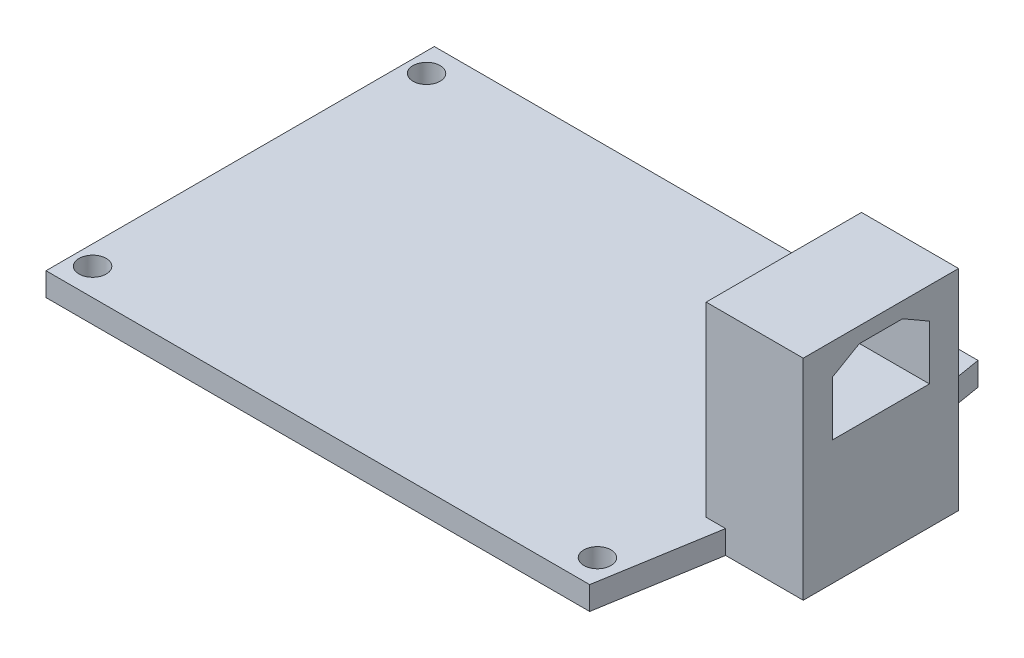
ISO-10303-21;
HEADER;
FILE_DESCRIPTION(('STEP AP214'),'2;1');
FILE_NAME('part.step','',(''),(''),'','','');
FILE_SCHEMA(('AUTOMOTIVE_DESIGN { 1 0 10303 214 1 1 1 1 }'));
ENDSEC;
DATA;
#1=APPLICATION_CONTEXT('core data for automotive mechanical design processes');
#2=APPLICATION_PROTOCOL_DEFINITION('international standard','automotive_design',2000,#1);
#3=PRODUCT_CONTEXT('',#1,'mechanical');
#4=PRODUCT('Part','Part','',(#3));
#5=PRODUCT_RELATED_PRODUCT_CATEGORY('part','',(#4));
#6=PRODUCT_DEFINITION_FORMATION('','',#4);
#7=PRODUCT_DEFINITION_CONTEXT('part definition',#1,'design');
#8=PRODUCT_DEFINITION('design','',#6,#7);
#9=PRODUCT_DEFINITION_SHAPE('','',#8);
#10=(LENGTH_UNIT() NAMED_UNIT(*) SI_UNIT(.MILLI.,.METRE.));
#11=(NAMED_UNIT(*) PLANE_ANGLE_UNIT() SI_UNIT($,.RADIAN.));
#12=(NAMED_UNIT(*) SI_UNIT($,.STERADIAN.) SOLID_ANGLE_UNIT());
#13=UNCERTAINTY_MEASURE_WITH_UNIT(LENGTH_MEASURE(1.E-05),#10,'distance_accuracy_value','');
#14=(GEOMETRIC_REPRESENTATION_CONTEXT(3) GLOBAL_UNCERTAINTY_ASSIGNED_CONTEXT((#13)) GLOBAL_UNIT_ASSIGNED_CONTEXT((#10,
#11,#12)) REPRESENTATION_CONTEXT('',''));
#15=CARTESIAN_POINT('',(0.,0.,0.));
#16=DIRECTION('',(0.,0.,1.));
#17=DIRECTION('',(1.,0.,0.));
#18=AXIS2_PLACEMENT_3D('',#15,#16,#17);
#19=CARTESIAN_POINT('',(35.,28.,0.));
#20=DIRECTION('',(-1.,0.,0.));
#21=DIRECTION('',(0.,0.,1.));
#22=AXIS2_PLACEMENT_3D('',#19,#20,#21);
#23=PLANE('',#22);
#24=DIRECTION('',(0.,0.,1.));
#25=VECTOR('',#24,1.);
#26=CARTESIAN_POINT('',(35.,27.,0.));
#27=LINE('',#26,#25);
#28=CARTESIAN_POINT('',(35.,27.,-10.));
#29=VERTEX_POINT('',#28);
#30=CARTESIAN_POINT('',(35.,27.,10.));
#31=VERTEX_POINT('',#30);
#32=EDGE_CURVE('E176',#29,#31,#27,.T.);
#33=ORIENTED_EDGE('',*,*,#32,.F.);
#34=DIRECTION('',(0.,-1.,0.));
#35=VECTOR('',#34,1.);
#36=CARTESIAN_POINT('',(35.,28.,-10.));
#37=LINE('',#36,#35);
#38=CARTESIAN_POINT('',(35.,3.,-10.));
#39=VERTEX_POINT('',#38);
#40=EDGE_CURVE('E189',#29,#39,#37,.T.);
#41=ORIENTED_EDGE('',*,*,#40,.T.);
#42=DIRECTION('',(0.,0.,-1.));
#43=VECTOR('',#42,1.);
#44=CARTESIAN_POINT('',(35.,3.,25.));
#45=LINE('',#44,#43);
#46=CARTESIAN_POINT('',(35.,3.,10.));
#47=VERTEX_POINT('',#46);
#48=EDGE_CURVE('E187',#47,#39,#45,.T.);
#49=ORIENTED_EDGE('',*,*,#48,.F.);
#50=DIRECTION('',(0.,-1.,0.));
#51=VECTOR('',#50,1.);
#52=CARTESIAN_POINT('',(35.,28.,10.));
#53=LINE('',#52,#51);
#54=EDGE_CURVE('E164',#31,#47,#53,.T.);
#55=ORIENTED_EDGE('',*,*,#54,.F.);
#56=EDGE_LOOP('',(#33,#41,#49,#55));
#57=FACE_BOUND('',#56,.T.);
#58=DIRECTION('',(0.,0.499999999999998,0.86602540378444));
#59=VECTOR('',#58,1.);
#60=CARTESIAN_POINT('',(35.,26.9563293868264,0.602563509461099));
#61=LINE('',#60,#59);
#62=CARTESIAN_POINT('',(35.,23.,-6.25000000000001));
#63=VERTEX_POINT('',#62);
#64=CARTESIAN_POINT('',(35.,25.,-2.78589838486224));
#65=VERTEX_POINT('',#64);
#66=EDGE_CURVE('E322',#63,#65,#61,.T.);
#67=ORIENTED_EDGE('',*,*,#66,.T.);
#68=DIRECTION('',(0.,0.,1.));
#69=VECTOR('',#68,1.);
#70=CARTESIAN_POINT('',(35.,25.,0.));
#71=LINE('',#70,#69);
#72=CARTESIAN_POINT('',(35.,25.,2.78589838486223));
#73=VERTEX_POINT('',#72);
#74=EDGE_CURVE('E316',#65,#73,#71,.T.);
#75=ORIENTED_EDGE('',*,*,#74,.T.);
#76=DIRECTION('',(0.,-0.5,0.866025403784439));
#77=VECTOR('',#76,1.);
#78=CARTESIAN_POINT('',(35.,26.9563293868264,-0.602563509461099));
#79=LINE('',#78,#77);
#80=CARTESIAN_POINT('',(35.,23.,6.24999999999999));
#81=VERTEX_POINT('',#80);
#82=EDGE_CURVE('E336',#73,#81,#79,.T.);
#83=ORIENTED_EDGE('',*,*,#82,.T.);
#84=DIRECTION('',(0.,1.,0.));
#85=VECTOR('',#84,1.);
#86=CARTESIAN_POINT('',(35.,28.,6.24999999999999));
#87=LINE('',#86,#85);
#88=CARTESIAN_POINT('',(35.,16.,6.24999999999999));
#89=VERTEX_POINT('',#88);
#90=EDGE_CURVE('E333',#89,#81,#87,.T.);
#91=ORIENTED_EDGE('',*,*,#90,.F.);
#92=DIRECTION('',(0.,0.,1.));
#93=VECTOR('',#92,1.);
#94=CARTESIAN_POINT('',(35.,16.,0.));
#95=LINE('',#94,#93);
#96=CARTESIAN_POINT('',(35.,16.,-6.25000000000001));
#97=VERTEX_POINT('',#96);
#98=EDGE_CURVE('E330',#97,#89,#95,.T.);
#99=ORIENTED_EDGE('',*,*,#98,.F.);
#100=DIRECTION('',(0.,1.,0.));
#101=VECTOR('',#100,1.);
#102=CARTESIAN_POINT('',(35.,28.,-6.25000000000001));
#103=LINE('',#102,#101);
#104=EDGE_CURVE('E326',#97,#63,#103,.T.);
#105=ORIENTED_EDGE('',*,*,#104,.T.);
#106=EDGE_LOOP('',(#67,#75,#83,#91,#99,#105));
#107=FACE_BOUND('',#106,.T.);
#108=ADVANCED_FACE('F45',(#57,#107),#23,.T.);
#109=CARTESIAN_POINT('',(-35.,3.,25.));
#110=DIRECTION('',(1.,0.,0.));
#111=DIRECTION('',(0.,0.,-1.));
#112=AXIS2_PLACEMENT_3D('',#109,#110,#111);
#113=PLANE('',#112);
#114=DIRECTION('',(0.,0.,1.));
#115=VECTOR('',#114,1.);
#116=CARTESIAN_POINT('',(-35.,0.,25.));
#117=LINE('',#116,#115);
#118=CARTESIAN_POINT('',(-35.,0.,-25.));
#119=VERTEX_POINT('',#118);
#120=CARTESIAN_POINT('',(-35.,0.,25.));
#121=VERTEX_POINT('',#120);
#122=EDGE_CURVE('E232',#119,#121,#117,.T.);
#123=ORIENTED_EDGE('',*,*,#122,.T.);
#124=DIRECTION('',(0.,-1.,0.));
#125=VECTOR('',#124,1.);
#126=CARTESIAN_POINT('',(-35.,3.,25.));
#127=LINE('',#126,#125);
#128=CARTESIAN_POINT('',(-35.,3.,25.));
#129=VERTEX_POINT('',#128);
#130=EDGE_CURVE('E11',#129,#121,#127,.T.);
#131=ORIENTED_EDGE('',*,*,#130,.F.);
#132=DIRECTION('',(0.,0.,1.));
#133=VECTOR('',#132,1.);
#134=CARTESIAN_POINT('',(-35.,3.,25.));
#135=LINE('',#134,#133);
#136=CARTESIAN_POINT('',(-35.,3.,-25.));
#137=VERTEX_POINT('',#136);
#138=EDGE_CURVE('E218',#137,#129,#135,.T.);
#139=ORIENTED_EDGE('',*,*,#138,.F.);
#140=DIRECTION('',(0.,-1.,0.));
#141=VECTOR('',#140,1.);
#142=CARTESIAN_POINT('',(-35.,3.,-25.));
#143=LINE('',#142,#141);
#144=EDGE_CURVE('E231',#137,#119,#143,.T.);
#145=ORIENTED_EDGE('',*,*,#144,.T.);
#146=EDGE_LOOP('',(#123,#131,#139,#145));
#147=FACE_BOUND('',#146,.T.);
#148=ADVANCED_FACE('F47',(#147),#113,.F.);
#149=CARTESIAN_POINT('',(-35.,3.,25.));
#150=DIRECTION('',(0.,0.,-1.));
#151=DIRECTION('',(-1.,0.,0.));
#152=AXIS2_PLACEMENT_3D('',#149,#150,#151);
#153=PLANE('',#152);
#154=DIRECTION('',(1.,0.,0.));
#155=VECTOR('',#154,1.);
#156=CARTESIAN_POINT('',(-35.,0.,25.));
#157=LINE('',#156,#155);
#158=CARTESIAN_POINT('',(35.,0.,25.));
#159=VERTEX_POINT('',#158);
#160=EDGE_CURVE('E236',#121,#159,#157,.T.);
#161=ORIENTED_EDGE('',*,*,#160,.T.);
#162=DIRECTION('',(0.,-1.,0.));
#163=VECTOR('',#162,1.);
#164=CARTESIAN_POINT('',(35.,3.,25.));
#165=LINE('',#164,#163);
#166=CARTESIAN_POINT('',(35.,3.,25.));
#167=VERTEX_POINT('',#166);
#168=EDGE_CURVE('E55',#167,#159,#165,.T.);
#169=ORIENTED_EDGE('',*,*,#168,.F.);
#170=DIRECTION('',(1.,0.,0.));
#171=VECTOR('',#170,1.);
#172=CARTESIAN_POINT('',(-35.,3.,25.));
#173=LINE('',#172,#171);
#174=EDGE_CURVE('E222',#129,#167,#173,.T.);
#175=ORIENTED_EDGE('',*,*,#174,.F.);
#176=ORIENTED_EDGE('',*,*,#130,.T.);
#177=EDGE_LOOP('',(#161,#169,#175,#176));
#178=FACE_BOUND('',#177,.T.);
#179=ADVANCED_FACE('F291',(#178),#153,.F.);
#180=CARTESIAN_POINT('',(-35.,3.,-25.));
#181=DIRECTION('',(0.,0.,1.));
#182=DIRECTION('',(1.,0.,0.));
#183=AXIS2_PLACEMENT_3D('',#180,#181,#182);
#184=PLANE('',#183);
#185=DIRECTION('',(-1.,0.,0.));
#186=VECTOR('',#185,1.);
#187=CARTESIAN_POINT('',(-35.,0.,-25.));
#188=LINE('',#187,#186);
#189=CARTESIAN_POINT('',(35.,0.,-25.));
#190=VERTEX_POINT('',#189);
#191=EDGE_CURVE('E223',#190,#119,#188,.T.);
#192=ORIENTED_EDGE('',*,*,#191,.T.);
#193=ORIENTED_EDGE('',*,*,#144,.F.);
#194=DIRECTION('',(-1.,0.,0.));
#195=VECTOR('',#194,1.);
#196=CARTESIAN_POINT('',(-35.,3.,-25.));
#197=LINE('',#196,#195);
#198=CARTESIAN_POINT('',(35.,3.,-25.));
#199=VERTEX_POINT('',#198);
#200=EDGE_CURVE('E228',#199,#137,#197,.T.);
#201=ORIENTED_EDGE('',*,*,#200,.F.);
#202=DIRECTION('',(0.,-1.,0.));
#203=VECTOR('',#202,1.);
#204=CARTESIAN_POINT('',(35.,3.,-25.));
#205=LINE('',#204,#203);
#206=EDGE_CURVE('E244',#199,#190,#205,.T.);
#207=ORIENTED_EDGE('',*,*,#206,.T.);
#208=EDGE_LOOP('',(#192,#193,#201,#207));
#209=FACE_BOUND('',#208,.T.);
#210=ADVANCED_FACE('F274',(#209),#184,.F.);
#211=CARTESIAN_POINT('',(0.,3.,0.));
#212=DIRECTION('',(0.,-1.,0.));
#213=DIRECTION('',(0.,0.,-1.));
#214=AXIS2_PLACEMENT_3D('',#211,#212,#213);
#215=PLANE('',#214);
#216=CARTESIAN_POINT('',(-32.5,3.,-21.5));
#217=DIRECTION('',(0.,1.,0.));
#218=DIRECTION('',(0.,0.,-1.));
#219=AXIS2_PLACEMENT_3D('',#216,#217,#218);
#220=CIRCLE('',#219,1.75);
#221=CARTESIAN_POINT('',(-32.5,3.,-23.25));
#222=VERTEX_POINT('',#221);
#223=EDGE_CURVE('E194',#222,#222,#220,.T.);
#224=ORIENTED_EDGE('',*,*,#223,.F.);
#225=EDGE_LOOP('',(#224));
#226=FACE_BOUND('',#225,.T.);
#227=CARTESIAN_POINT('',(32.5,3.,-21.5));
#228=DIRECTION('',(0.,-1.,0.));
#229=DIRECTION('',(0.,0.,-1.));
#230=AXIS2_PLACEMENT_3D('',#227,#228,#229);
#231=CIRCLE('',#230,1.75);
#232=CARTESIAN_POINT('',(32.5,3.,-23.25));
#233=VERTEX_POINT('',#232);
#234=EDGE_CURVE('E203',#233,#233,#231,.T.);
#235=ORIENTED_EDGE('',*,*,#234,.T.);
#236=EDGE_LOOP('',(#235));
#237=FACE_BOUND('',#236,.T.);
#238=CARTESIAN_POINT('',(-32.5,3.,21.5));
#239=DIRECTION('',(0.,-1.,0.));
#240=DIRECTION('',(0.,0.,1.));
#241=AXIS2_PLACEMENT_3D('',#238,#239,#240);
#242=CIRCLE('',#241,1.75);
#243=CARTESIAN_POINT('',(-32.5,3.,23.25));
#244=VERTEX_POINT('',#243);
#245=EDGE_CURVE('E208',#244,#244,#242,.T.);
#246=ORIENTED_EDGE('',*,*,#245,.T.);
#247=EDGE_LOOP('',(#246));
#248=FACE_BOUND('',#247,.T.);
#249=CARTESIAN_POINT('',(32.5,3.,21.5));
#250=DIRECTION('',(0.,1.,0.));
#251=DIRECTION('',(0.,0.,1.));
#252=AXIS2_PLACEMENT_3D('',#249,#250,#251);
#253=CIRCLE('',#252,1.75);
#254=CARTESIAN_POINT('',(32.5,3.,23.25));
#255=VERTEX_POINT('',#254);
#256=EDGE_CURVE('E213',#255,#255,#253,.T.);
#257=ORIENTED_EDGE('',*,*,#256,.F.);
#258=EDGE_LOOP('',(#257));
#259=FACE_BOUND('',#258,.T.);
#260=ORIENTED_EDGE('',*,*,#138,.T.);
#261=ORIENTED_EDGE('',*,*,#174,.T.);
#262=DIRECTION('',(0.164398987305358,0.,-0.986393923832144));
#263=VECTOR('',#262,1.);
#264=CARTESIAN_POINT('',(37.5,3.,10.));
#265=LINE('',#264,#263);
#266=CARTESIAN_POINT('',(37.5,3.,10.));
#267=VERTEX_POINT('',#266);
#268=EDGE_CURVE('E295',#167,#267,#265,.T.);
#269=ORIENTED_EDGE('',*,*,#268,.T.);
#270=DIRECTION('',(-1.,0.,0.));
#271=VECTOR('',#270,1.);
#272=CARTESIAN_POINT('',(37.5,3.,10.));
#273=LINE('',#272,#271);
#274=EDGE_CURVE('E71',#267,#47,#273,.T.);
#275=ORIENTED_EDGE('',*,*,#274,.T.);
#276=ORIENTED_EDGE('',*,*,#48,.T.);
#277=DIRECTION('',(-1.,0.,0.));
#278=VECTOR('',#277,1.);
#279=CARTESIAN_POINT('',(37.5,3.,-10.));
#280=LINE('',#279,#278);
#281=CARTESIAN_POINT('',(37.5,3.,-10.));
#282=VERTEX_POINT('',#281);
#283=EDGE_CURVE('E312',#282,#39,#280,.T.);
#284=ORIENTED_EDGE('',*,*,#283,.F.);
#285=DIRECTION('',(0.164398987305358,0.,0.986393923832144));
#286=VECTOR('',#285,1.);
#287=CARTESIAN_POINT('',(37.5,3.,-10.));
#288=LINE('',#287,#286);
#289=EDGE_CURVE('E308',#199,#282,#288,.T.);
#290=ORIENTED_EDGE('',*,*,#289,.F.);
#291=ORIENTED_EDGE('',*,*,#200,.T.);
#292=EDGE_LOOP('',(#260,#261,#269,#275,#276,#284,#290,#291));
#293=FACE_BOUND('',#292,.T.);
#294=ADVANCED_FACE('F271',(#226,#237,#248,#259,#293),#215,.F.);
#295=CARTESIAN_POINT('',(0.,0.,0.));
#296=DIRECTION('',(0.,-1.,0.));
#297=DIRECTION('',(0.,0.,-1.));
#298=AXIS2_PLACEMENT_3D('',#295,#296,#297);
#299=PLANE('',#298);
#300=ORIENTED_EDGE('',*,*,#191,.F.);
#301=DIRECTION('',(0.164398987305358,0.,0.986393923832144));
#302=VECTOR('',#301,1.);
#303=CARTESIAN_POINT('',(37.5,0.,-10.));
#304=LINE('',#303,#302);
#305=CARTESIAN_POINT('',(37.5,0.,-10.));
#306=VERTEX_POINT('',#305);
#307=EDGE_CURVE('E307',#190,#306,#304,.T.);
#308=ORIENTED_EDGE('',*,*,#307,.T.);
#309=DIRECTION('',(-1.,0.,0.));
#310=VECTOR('',#309,1.);
#311=CARTESIAN_POINT('',(47.5,0.,-10.));
#312=LINE('',#311,#310);
#313=CARTESIAN_POINT('',(47.5,0.,-10.));
#314=VERTEX_POINT('',#313);
#315=EDGE_CURVE('E382',#314,#306,#312,.T.);
#316=ORIENTED_EDGE('',*,*,#315,.F.);
#317=DIRECTION('',(0.,0.,-1.));
#318=VECTOR('',#317,1.);
#319=CARTESIAN_POINT('',(47.5,0.,0.));
#320=LINE('',#319,#318);
#321=CARTESIAN_POINT('',(47.5,0.,10.));
#322=VERTEX_POINT('',#321);
#323=EDGE_CURVE('E391',#322,#314,#320,.T.);
#324=ORIENTED_EDGE('',*,*,#323,.F.);
#325=DIRECTION('',(-1.,0.,0.));
#326=VECTOR('',#325,1.);
#327=CARTESIAN_POINT('',(47.5,0.,10.));
#328=LINE('',#327,#326);
#329=CARTESIAN_POINT('',(37.5,0.,10.));
#330=VERTEX_POINT('',#329);
#331=EDGE_CURVE('E173',#322,#330,#328,.T.);
#332=ORIENTED_EDGE('',*,*,#331,.T.);
#333=DIRECTION('',(0.164398987305358,0.,-0.986393923832144));
#334=VECTOR('',#333,1.);
#335=CARTESIAN_POINT('',(37.5,0.,10.));
#336=LINE('',#335,#334);
#337=EDGE_CURVE('E196',#159,#330,#336,.T.);
#338=ORIENTED_EDGE('',*,*,#337,.F.);
#339=ORIENTED_EDGE('',*,*,#160,.F.);
#340=ORIENTED_EDGE('',*,*,#122,.F.);
#341=EDGE_LOOP('',(#300,#308,#316,#324,#332,#338,#339,#340));
#342=FACE_BOUND('',#341,.T.);
#343=CARTESIAN_POINT('',(-32.5,0.,-21.5));
#344=DIRECTION('',(0.,-1.,0.));
#345=DIRECTION('',(0.,0.,-1.));
#346=AXIS2_PLACEMENT_3D('',#343,#344,#345);
#347=CIRCLE('',#346,1.75);
#348=CARTESIAN_POINT('',(-32.5,0.,-23.25));
#349=VERTEX_POINT('',#348);
#350=EDGE_CURVE('E49',#349,#349,#347,.T.);
#351=ORIENTED_EDGE('',*,*,#350,.F.);
#352=EDGE_LOOP('',(#351));
#353=FACE_BOUND('',#352,.T.);
#354=CARTESIAN_POINT('',(32.5,0.,-21.5));
#355=DIRECTION('',(0.,-1.,0.));
#356=DIRECTION('',(0.,0.,-1.));
#357=AXIS2_PLACEMENT_3D('',#354,#355,#356);
#358=CIRCLE('',#357,1.75);
#359=CARTESIAN_POINT('',(32.5,0.,-23.25));
#360=VERTEX_POINT('',#359);
#361=EDGE_CURVE('E207',#360,#360,#358,.F.);
#362=ORIENTED_EDGE('',*,*,#361,.T.);
#363=EDGE_LOOP('',(#362));
#364=FACE_BOUND('',#363,.T.);
#365=CARTESIAN_POINT('',(-32.5,0.,21.5));
#366=DIRECTION('',(0.,-1.,0.));
#367=DIRECTION('',(0.,0.,-1.));
#368=AXIS2_PLACEMENT_3D('',#365,#366,#367);
#369=CIRCLE('',#368,1.75);
#370=CARTESIAN_POINT('',(-32.5,0.,19.75));
#371=VERTEX_POINT('',#370);
#372=EDGE_CURVE('E212',#371,#371,#369,.F.);
#373=ORIENTED_EDGE('',*,*,#372,.T.);
#374=EDGE_LOOP('',(#373));
#375=FACE_BOUND('',#374,.T.);
#376=CARTESIAN_POINT('',(32.5,0.,21.5));
#377=DIRECTION('',(0.,-1.,0.));
#378=DIRECTION('',(0.,0.,-1.));
#379=AXIS2_PLACEMENT_3D('',#376,#377,#378);
#380=CIRCLE('',#379,1.75);
#381=CARTESIAN_POINT('',(32.5,0.,19.75));
#382=VERTEX_POINT('',#381);
#383=EDGE_CURVE('E217',#382,#382,#380,.T.);
#384=ORIENTED_EDGE('',*,*,#383,.F.);
#385=EDGE_LOOP('',(#384));
#386=FACE_BOUND('',#385,.T.);
#387=ADVANCED_FACE('F260',(#342,#353,#364,#375,#386),#299,.T.);
#388=CARTESIAN_POINT('',(32.5,-7.,21.5));
#389=DIRECTION('',(0.,1.,0.));
#390=DIRECTION('',(0.,0.,1.));
#391=AXIS2_PLACEMENT_3D('',#388,#389,#390);
#392=CYLINDRICAL_SURFACE('',#391,1.75);
#393=ORIENTED_EDGE('',*,*,#383,.T.);
#394=EDGE_LOOP('',(#393));
#395=FACE_BOUND('',#394,.T.);
#396=ORIENTED_EDGE('',*,*,#256,.T.);
#397=EDGE_LOOP('',(#396));
#398=FACE_BOUND('',#397,.T.);
#399=ADVANCED_FACE('F412',(#395,#398),#392,.F.);
#400=CARTESIAN_POINT('',(-32.5,-7.,21.5));
#401=DIRECTION('',(0.,1.,0.));
#402=DIRECTION('',(0.,0.,1.));
#403=AXIS2_PLACEMENT_3D('',#400,#401,#402);
#404=CYLINDRICAL_SURFACE('',#403,1.75);
#405=ORIENTED_EDGE('',*,*,#372,.F.);
#406=EDGE_LOOP('',(#405));
#407=FACE_BOUND('',#406,.T.);
#408=ORIENTED_EDGE('',*,*,#245,.F.);
#409=EDGE_LOOP('',(#408));
#410=FACE_BOUND('',#409,.T.);
#411=ADVANCED_FACE('F267',(#407,#410),#404,.F.);
#412=CARTESIAN_POINT('',(32.5,-7.,-21.5));
#413=DIRECTION('',(0.,1.,0.));
#414=DIRECTION('',(0.,0.,1.));
#415=AXIS2_PLACEMENT_3D('',#412,#413,#414);
#416=CYLINDRICAL_SURFACE('',#415,1.75);
#417=ORIENTED_EDGE('',*,*,#361,.F.);
#418=EDGE_LOOP('',(#417));
#419=FACE_BOUND('',#418,.T.);
#420=ORIENTED_EDGE('',*,*,#234,.F.);
#421=EDGE_LOOP('',(#420));
#422=FACE_BOUND('',#421,.T.);
#423=ADVANCED_FACE('F263',(#419,#422),#416,.F.);
#424=CARTESIAN_POINT('',(-32.5,-7.,-21.5));
#425=DIRECTION('',(0.,1.,0.));
#426=DIRECTION('',(0.,0.,1.));
#427=AXIS2_PLACEMENT_3D('',#424,#425,#426);
#428=CYLINDRICAL_SURFACE('',#427,1.75);
#429=ORIENTED_EDGE('',*,*,#350,.T.);
#430=EDGE_LOOP('',(#429));
#431=FACE_BOUND('',#430,.T.);
#432=ORIENTED_EDGE('',*,*,#223,.T.);
#433=EDGE_LOOP('',(#432));
#434=FACE_BOUND('',#433,.T.);
#435=ADVANCED_FACE('F266',(#431,#434),#428,.F.);
#436=CARTESIAN_POINT('',(0.,28.,-10.));
#437=DIRECTION('',(0.,0.,1.));
#438=DIRECTION('',(1.,0.,0.));
#439=AXIS2_PLACEMENT_3D('',#436,#437,#438);
#440=PLANE('',#439);
#441=ORIENTED_EDGE('',*,*,#40,.F.);
#442=DIRECTION('',(-1.,0.,0.));
#443=VECTOR('',#442,1.);
#444=CARTESIAN_POINT('',(47.5,27.,-10.));
#445=LINE('',#444,#443);
#446=CARTESIAN_POINT('',(47.5,27.,-10.));
#447=VERTEX_POINT('',#446);
#448=EDGE_CURVE('E179',#447,#29,#445,.T.);
#449=ORIENTED_EDGE('',*,*,#448,.F.);
#450=DIRECTION('',(0.,1.,0.));
#451=VECTOR('',#450,1.);
#452=CARTESIAN_POINT('',(47.5,0.,-10.));
#453=LINE('',#452,#451);
#454=EDGE_CURVE('E388',#314,#447,#453,.T.);
#455=ORIENTED_EDGE('',*,*,#454,.F.);
#456=ORIENTED_EDGE('',*,*,#315,.T.);
#457=DIRECTION('',(0.,1.,0.));
#458=VECTOR('',#457,1.);
#459=CARTESIAN_POINT('',(37.5,0.,-10.));
#460=LINE('',#459,#458);
#461=EDGE_CURVE('E301',#306,#282,#460,.T.);
#462=ORIENTED_EDGE('',*,*,#461,.T.);
#463=ORIENTED_EDGE('',*,*,#283,.T.);
#464=EDGE_LOOP('',(#441,#449,#455,#456,#462,#463));
#465=FACE_BOUND('',#464,.T.);
#466=ADVANCED_FACE('F403',(#465),#440,.F.);
#467=CARTESIAN_POINT('',(0.,28.,10.));
#468=DIRECTION('',(0.,0.,1.));
#469=DIRECTION('',(1.,0.,0.));
#470=AXIS2_PLACEMENT_3D('',#467,#468,#469);
#471=PLANE('',#470);
#472=DIRECTION('',(-1.,0.,0.));
#473=VECTOR('',#472,1.);
#474=CARTESIAN_POINT('',(47.5,27.,10.));
#475=LINE('',#474,#473);
#476=CARTESIAN_POINT('',(47.5,27.,10.));
#477=VERTEX_POINT('',#476);
#478=EDGE_CURVE('E160',#477,#31,#475,.T.);
#479=ORIENTED_EDGE('',*,*,#478,.T.);
#480=ORIENTED_EDGE('',*,*,#54,.T.);
#481=ORIENTED_EDGE('',*,*,#274,.F.);
#482=DIRECTION('',(0.,1.,0.));
#483=VECTOR('',#482,1.);
#484=CARTESIAN_POINT('',(37.5,0.,10.));
#485=LINE('',#484,#483);
#486=EDGE_CURVE('E190',#330,#267,#485,.T.);
#487=ORIENTED_EDGE('',*,*,#486,.F.);
#488=ORIENTED_EDGE('',*,*,#331,.F.);
#489=DIRECTION('',(0.,-1.,0.));
#490=VECTOR('',#489,1.);
#491=CARTESIAN_POINT('',(47.5,0.,10.));
#492=LINE('',#491,#490);
#493=EDGE_CURVE('E167',#477,#322,#492,.T.);
#494=ORIENTED_EDGE('',*,*,#493,.F.);
#495=EDGE_LOOP('',(#479,#480,#481,#487,#488,#494));
#496=FACE_BOUND('',#495,.T.);
#497=ADVANCED_FACE('F162',(#496),#471,.T.);
#498=CARTESIAN_POINT('',(37.5,0.,10.));
#499=DIRECTION('',(0.986393923832144,0.,0.164398987305358));
#500=DIRECTION('',(0.164398987305358,0.,-0.986393923832144));
#501=AXIS2_PLACEMENT_3D('',#498,#499,#500);
#502=PLANE('',#501);
#503=ORIENTED_EDGE('',*,*,#268,.F.);
#504=ORIENTED_EDGE('',*,*,#168,.T.);
#505=ORIENTED_EDGE('',*,*,#337,.T.);
#506=ORIENTED_EDGE('',*,*,#486,.T.);
#507=EDGE_LOOP('',(#503,#504,#505,#506));
#508=FACE_BOUND('',#507,.T.);
#509=ADVANCED_FACE('F296',(#508),#502,.T.);
#510=CARTESIAN_POINT('',(37.5,0.,-10.));
#511=DIRECTION('',(-0.986393923832144,0.,0.164398987305358));
#512=DIRECTION('',(0.164398987305358,0.,0.986393923832144));
#513=AXIS2_PLACEMENT_3D('',#510,#511,#512);
#514=PLANE('',#513);
#515=ORIENTED_EDGE('',*,*,#289,.T.);
#516=ORIENTED_EDGE('',*,*,#461,.F.);
#517=ORIENTED_EDGE('',*,*,#307,.F.);
#518=ORIENTED_EDGE('',*,*,#206,.F.);
#519=EDGE_LOOP('',(#515,#516,#517,#518));
#520=FACE_BOUND('',#519,.T.);
#521=ADVANCED_FACE('F406',(#520),#514,.F.);
#522=CARTESIAN_POINT('',(34.5,25.,0.));
#523=DIRECTION('',(0.,-1.,0.));
#524=DIRECTION('',(0.,0.,-1.));
#525=AXIS2_PLACEMENT_3D('',#522,#523,#524);
#526=PLANE('',#525);
#527=DIRECTION('',(1.,0.,0.));
#528=VECTOR('',#527,1.);
#529=CARTESIAN_POINT('',(34.5,25.,-2.78589838486224));
#530=LINE('',#529,#528);
#531=CARTESIAN_POINT('',(47.5,25.,-2.78589838486224));
#532=VERTEX_POINT('',#531);
#533=EDGE_CURVE('E340',#65,#532,#530,.T.);
#534=ORIENTED_EDGE('',*,*,#533,.T.);
#535=DIRECTION('',(0.,0.,1.));
#536=VECTOR('',#535,1.);
#537=CARTESIAN_POINT('',(47.5,25.,2.78589838486223));
#538=LINE('',#537,#536);
#539=CARTESIAN_POINT('',(47.5,25.,2.78589838486223));
#540=VERTEX_POINT('',#539);
#541=EDGE_CURVE('E344',#532,#540,#538,.T.);
#542=ORIENTED_EDGE('',*,*,#541,.T.);
#543=DIRECTION('',(1.,0.,0.));
#544=VECTOR('',#543,1.);
#545=CARTESIAN_POINT('',(34.5,25.,2.78589838486223));
#546=LINE('',#545,#544);
#547=EDGE_CURVE('E341',#73,#540,#546,.T.);
#548=ORIENTED_EDGE('',*,*,#547,.F.);
#549=ORIENTED_EDGE('',*,*,#74,.F.);
#550=EDGE_LOOP('',(#534,#542,#548,#549));
#551=FACE_BOUND('',#550,.T.);
#552=ADVANCED_FACE('F438',(#551),#526,.T.);
#553=CARTESIAN_POINT('',(34.5,19.9563293868264,-11.521792143521));
#554=DIRECTION('',(0.,-0.86602540378444,0.499999999999998));
#555=DIRECTION('',(0.,-0.499999999999998,-0.86602540378444));
#556=AXIS2_PLACEMENT_3D('',#553,#554,#555);
#557=PLANE('',#556);
#558=DIRECTION('',(1.,0.,0.));
#559=VECTOR('',#558,1.);
#560=CARTESIAN_POINT('',(34.5,23.,-6.25000000000001));
#561=LINE('',#560,#559);
#562=CARTESIAN_POINT('',(47.5,23.,-6.25000000000001));
#563=VERTEX_POINT('',#562);
#564=EDGE_CURVE('E353',#63,#563,#561,.T.);
#565=ORIENTED_EDGE('',*,*,#564,.T.);
#566=DIRECTION('',(0.,0.499999999999999,0.866025403784439));
#567=VECTOR('',#566,1.);
#568=CARTESIAN_POINT('',(47.5,25.,-2.78589838486224));
#569=LINE('',#568,#567);
#570=EDGE_CURVE('E361',#563,#532,#569,.T.);
#571=ORIENTED_EDGE('',*,*,#570,.T.);
#572=ORIENTED_EDGE('',*,*,#533,.F.);
#573=ORIENTED_EDGE('',*,*,#66,.F.);
#574=EDGE_LOOP('',(#565,#571,#572,#573));
#575=FACE_BOUND('',#574,.T.);
#576=ADVANCED_FACE('F441',(#575),#557,.T.);
#577=CARTESIAN_POINT('',(34.5,0.,-6.25000000000001));
#578=DIRECTION('',(0.,0.,1.));
#579=DIRECTION('',(1.,0.,0.));
#580=AXIS2_PLACEMENT_3D('',#577,#578,#579);
#581=PLANE('',#580);
#582=DIRECTION('',(1.,0.,0.));
#583=VECTOR('',#582,1.);
#584=CARTESIAN_POINT('',(34.5,16.,-6.25000000000001));
#585=LINE('',#584,#583);
#586=CARTESIAN_POINT('',(47.5,16.,-6.25000000000001));
#587=VERTEX_POINT('',#586);
#588=EDGE_CURVE('E350',#97,#587,#585,.T.);
#589=ORIENTED_EDGE('',*,*,#588,.T.);
#590=DIRECTION('',(0.,1.,0.));
#591=VECTOR('',#590,1.);
#592=CARTESIAN_POINT('',(47.5,23.,-6.25000000000001));
#593=LINE('',#592,#591);
#594=EDGE_CURVE('E365',#587,#563,#593,.T.);
#595=ORIENTED_EDGE('',*,*,#594,.T.);
#596=ORIENTED_EDGE('',*,*,#564,.F.);
#597=ORIENTED_EDGE('',*,*,#104,.F.);
#598=EDGE_LOOP('',(#589,#595,#596,#597));
#599=FACE_BOUND('',#598,.T.);
#600=ADVANCED_FACE('F453',(#599),#581,.T.);
#601=CARTESIAN_POINT('',(34.5,16.,0.));
#602=DIRECTION('',(0.,-1.,0.));
#603=DIRECTION('',(0.,0.,-1.));
#604=AXIS2_PLACEMENT_3D('',#601,#602,#603);
#605=PLANE('',#604);
#606=ORIENTED_EDGE('',*,*,#98,.T.);
#607=DIRECTION('',(1.,0.,0.));
#608=VECTOR('',#607,1.);
#609=CARTESIAN_POINT('',(34.5,16.,6.24999999999999));
#610=LINE('',#609,#608);
#611=CARTESIAN_POINT('',(47.5,16.,6.24999999999999));
#612=VERTEX_POINT('',#611);
#613=EDGE_CURVE('E347',#89,#612,#610,.T.);
#614=ORIENTED_EDGE('',*,*,#613,.T.);
#615=DIRECTION('',(0.,0.,-1.));
#616=VECTOR('',#615,1.);
#617=CARTESIAN_POINT('',(47.5,16.,6.24999999999999));
#618=LINE('',#617,#616);
#619=EDGE_CURVE('E369',#612,#587,#618,.T.);
#620=ORIENTED_EDGE('',*,*,#619,.T.);
#621=ORIENTED_EDGE('',*,*,#588,.F.);
#622=EDGE_LOOP('',(#606,#614,#620,#621));
#623=FACE_BOUND('',#622,.T.);
#624=ADVANCED_FACE('F449',(#623),#605,.F.);
#625=CARTESIAN_POINT('',(34.5,0.,6.24999999999999));
#626=DIRECTION('',(0.,0.,1.));
#627=DIRECTION('',(1.,0.,0.));
#628=AXIS2_PLACEMENT_3D('',#625,#626,#627);
#629=PLANE('',#628);
#630=ORIENTED_EDGE('',*,*,#90,.T.);
#631=DIRECTION('',(1.,0.,0.));
#632=VECTOR('',#631,1.);
#633=CARTESIAN_POINT('',(34.5,23.,6.24999999999999));
#634=LINE('',#633,#632);
#635=CARTESIAN_POINT('',(47.5,23.,6.24999999999999));
#636=VERTEX_POINT('',#635);
#637=EDGE_CURVE('E63',#81,#636,#634,.T.);
#638=ORIENTED_EDGE('',*,*,#637,.T.);
#639=DIRECTION('',(0.,-1.,0.));
#640=VECTOR('',#639,1.);
#641=CARTESIAN_POINT('',(47.5,23.,6.24999999999999));
#642=LINE('',#641,#640);
#643=EDGE_CURVE('E373',#636,#612,#642,.T.);
#644=ORIENTED_EDGE('',*,*,#643,.T.);
#645=ORIENTED_EDGE('',*,*,#613,.F.);
#646=EDGE_LOOP('',(#630,#638,#644,#645));
#647=FACE_BOUND('',#646,.T.);
#648=ADVANCED_FACE('F446',(#647),#629,.F.);
#649=CARTESIAN_POINT('',(34.5,19.9563293868264,11.521792143521));
#650=DIRECTION('',(0.,-0.866025403784439,-0.5));
#651=DIRECTION('',(0.,0.5,-0.866025403784439));
#652=AXIS2_PLACEMENT_3D('',#649,#650,#651);
#653=PLANE('',#652);
#654=ORIENTED_EDGE('',*,*,#547,.T.);
#655=DIRECTION('',(0.,-0.5,0.866025403784439));
#656=VECTOR('',#655,1.);
#657=CARTESIAN_POINT('',(47.5,23.,6.24999999999999));
#658=LINE('',#657,#656);
#659=EDGE_CURVE('E172',#540,#636,#658,.T.);
#660=ORIENTED_EDGE('',*,*,#659,.T.);
#661=ORIENTED_EDGE('',*,*,#637,.F.);
#662=ORIENTED_EDGE('',*,*,#82,.F.);
#663=EDGE_LOOP('',(#654,#660,#661,#662));
#664=FACE_BOUND('',#663,.T.);
#665=ADVANCED_FACE('F443',(#664),#653,.T.);
#666=CARTESIAN_POINT('',(47.5,0.,0.));
#667=DIRECTION('',(1.,0.,0.));
#668=DIRECTION('',(0.,0.,-1.));
#669=AXIS2_PLACEMENT_3D('',#666,#667,#668);
#670=PLANE('',#669);
#671=ORIENTED_EDGE('',*,*,#643,.F.);
#672=ORIENTED_EDGE('',*,*,#659,.F.);
#673=ORIENTED_EDGE('',*,*,#541,.F.);
#674=ORIENTED_EDGE('',*,*,#570,.F.);
#675=ORIENTED_EDGE('',*,*,#594,.F.);
#676=ORIENTED_EDGE('',*,*,#619,.F.);
#677=EDGE_LOOP('',(#671,#672,#673,#674,#675,#676));
#678=FACE_BOUND('',#677,.T.);
#679=DIRECTION('',(0.,0.,-1.));
#680=VECTOR('',#679,1.);
#681=CARTESIAN_POINT('',(47.5,27.,0.));
#682=LINE('',#681,#680);
#683=EDGE_CURVE('E183',#477,#447,#682,.T.);
#684=ORIENTED_EDGE('',*,*,#683,.F.);
#685=ORIENTED_EDGE('',*,*,#493,.T.);
#686=ORIENTED_EDGE('',*,*,#323,.T.);
#687=ORIENTED_EDGE('',*,*,#454,.T.);
#688=EDGE_LOOP('',(#684,#685,#686,#687));
#689=FACE_BOUND('',#688,.T.);
#690=ADVANCED_FACE('F398',(#678,#689),#670,.T.);
#691=CARTESIAN_POINT('',(47.5,27.,0.));
#692=DIRECTION('',(0.,1.,0.));
#693=DIRECTION('',(0.,0.,1.));
#694=AXIS2_PLACEMENT_3D('',#691,#692,#693);
#695=PLANE('',#694);
#696=ORIENTED_EDGE('',*,*,#448,.T.);
#697=ORIENTED_EDGE('',*,*,#32,.T.);
#698=ORIENTED_EDGE('',*,*,#478,.F.);
#699=ORIENTED_EDGE('',*,*,#683,.T.);
#700=EDGE_LOOP('',(#696,#697,#698,#699));
#701=FACE_BOUND('',#700,.T.);
#702=ADVANCED_FACE('F177',(#701),#695,.T.);
#703=CLOSED_SHELL('',(#108,#148,#179,#210,#294,#387,#399,#411,#423,#435,#466,#497,#509,#521,
#552,#576,#600,#624,#648,#665,#690,#702));
#704=MANIFOLD_SOLID_BREP('B2',#703);
#705=ADVANCED_BREP_SHAPE_REPRESENTATION('',(#18,#704),#14);
#706=SHAPE_DEFINITION_REPRESENTATION(#9,#705);
ENDSEC;
END-ISO-10303-21;
